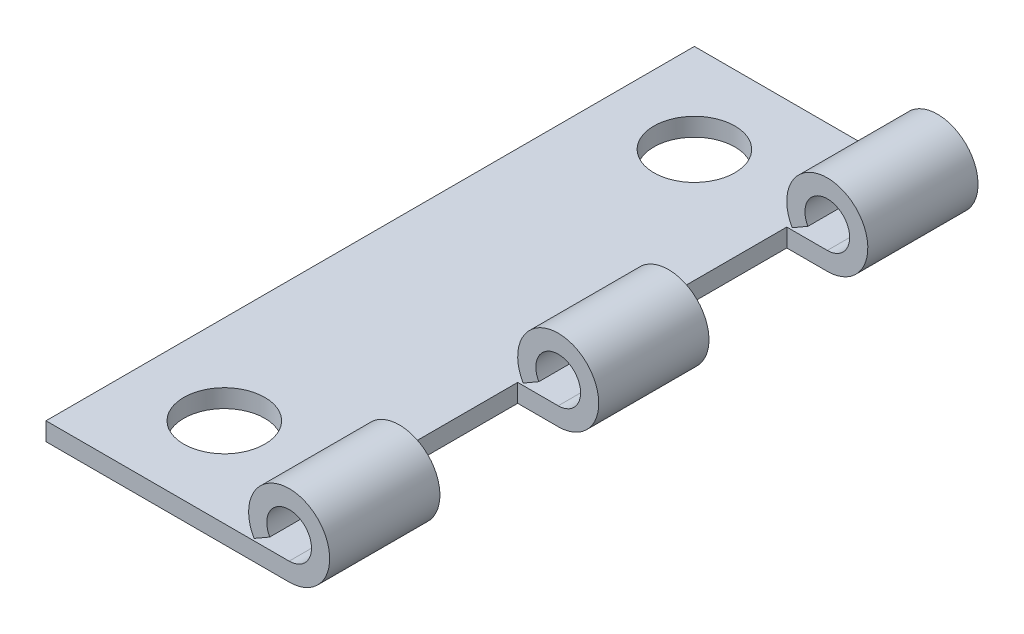
ISO-10303-21;
HEADER;
FILE_DESCRIPTION(('STEP AP214'),'2;1');
FILE_NAME('part.step','',(''),(''),'','','');
FILE_SCHEMA(('AUTOMOTIVE_DESIGN { 1 0 10303 214 1 1 1 1 }'));
ENDSEC;
DATA;
#1=APPLICATION_CONTEXT('core data for automotive mechanical design processes');
#2=APPLICATION_PROTOCOL_DEFINITION('international standard','automotive_design',2000,#1);
#3=PRODUCT_CONTEXT('',#1,'mechanical');
#4=PRODUCT('Part','Part','',(#3));
#5=PRODUCT_RELATED_PRODUCT_CATEGORY('part','',(#4));
#6=PRODUCT_DEFINITION_FORMATION('','',#4);
#7=PRODUCT_DEFINITION_CONTEXT('part definition',#1,'design');
#8=PRODUCT_DEFINITION('design','',#6,#7);
#9=PRODUCT_DEFINITION_SHAPE('','',#8);
#10=(LENGTH_UNIT() NAMED_UNIT(*) SI_UNIT(.MILLI.,.METRE.));
#11=(NAMED_UNIT(*) PLANE_ANGLE_UNIT() SI_UNIT($,.RADIAN.));
#12=(NAMED_UNIT(*) SI_UNIT($,.STERADIAN.) SOLID_ANGLE_UNIT());
#13=UNCERTAINTY_MEASURE_WITH_UNIT(LENGTH_MEASURE(1.E-05),#10,'distance_accuracy_value','');
#14=(GEOMETRIC_REPRESENTATION_CONTEXT(3) GLOBAL_UNCERTAINTY_ASSIGNED_CONTEXT((#13)) GLOBAL_UNIT_ASSIGNED_CONTEXT((#10,
#11,#12)) REPRESENTATION_CONTEXT('',''));
#15=CARTESIAN_POINT('',(0.,0.,0.));
#16=DIRECTION('',(0.,0.,1.));
#17=DIRECTION('',(1.,0.,0.));
#18=AXIS2_PLACEMENT_3D('',#15,#16,#17);
#19=CARTESIAN_POINT('',(0.,0.,50.8));
#20=DIRECTION('',(0.,1.,0.));
#21=DIRECTION('',(0.,0.,1.));
#22=AXIS2_PLACEMENT_3D('',#19,#20,#21);
#23=PLANE('',#22);
#24=CARTESIAN_POINT('',(6.985,0.,6.985));
#25=DIRECTION('',(0.,-1.,0.));
#26=DIRECTION('',(0.,0.,-1.));
#27=AXIS2_PLACEMENT_3D('',#24,#25,#26);
#28=CIRCLE('',#27,3.175);
#29=CARTESIAN_POINT('',(6.985,0.,3.81));
#30=VERTEX_POINT('',#29);
#31=EDGE_CURVE('E300',#30,#30,#28,.T.);
#32=ORIENTED_EDGE('',*,*,#31,.F.);
#33=EDGE_LOOP('',(#32));
#34=FACE_BOUND('',#33,.T.);
#35=CARTESIAN_POINT('',(6.985,0.,43.815));
#36=DIRECTION('',(0.,-1.,0.));
#37=DIRECTION('',(0.,0.,-1.));
#38=AXIS2_PLACEMENT_3D('',#35,#36,#37);
#39=CIRCLE('',#38,3.175);
#40=CARTESIAN_POINT('',(6.985,0.,40.64));
#41=VERTEX_POINT('',#40);
#42=EDGE_CURVE('E293',#41,#41,#39,.T.);
#43=ORIENTED_EDGE('',*,*,#42,.F.);
#44=EDGE_LOOP('',(#43));
#45=FACE_BOUND('',#44,.T.);
#46=DIRECTION('',(-1.,0.,0.));
#47=VECTOR('',#46,1.);
#48=CARTESIAN_POINT('',(0.,0.,29.718));
#49=LINE('',#48,#47);
#50=CARTESIAN_POINT('',(19.05,0.,29.718));
#51=VERTEX_POINT('',#50);
#52=CARTESIAN_POINT('',(15.875,0.,29.718));
#53=VERTEX_POINT('',#52);
#54=EDGE_CURVE('E173',#51,#53,#49,.T.);
#55=ORIENTED_EDGE('',*,*,#54,.T.);
#56=DIRECTION('',(0.,0.,-1.));
#57=VECTOR('',#56,1.);
#58=CARTESIAN_POINT('',(15.875,0.,0.));
#59=LINE('',#58,#57);
#60=CARTESIAN_POINT('',(15.875,0.,42.164));
#61=VERTEX_POINT('',#60);
#62=EDGE_CURVE('E170',#61,#53,#59,.T.);
#63=ORIENTED_EDGE('',*,*,#62,.F.);
#64=DIRECTION('',(1.,0.,0.));
#65=VECTOR('',#64,1.);
#66=CARTESIAN_POINT('',(0.,0.,42.164));
#67=LINE('',#66,#65);
#68=CARTESIAN_POINT('',(19.05,0.,42.164));
#69=VERTEX_POINT('',#68);
#70=EDGE_CURVE('E176',#61,#69,#67,.T.);
#71=ORIENTED_EDGE('',*,*,#70,.T.);
#72=DIRECTION('',(0.,0.,-1.));
#73=VECTOR('',#72,1.);
#74=CARTESIAN_POINT('',(19.05,0.,50.8));
#75=LINE('',#74,#73);
#76=CARTESIAN_POINT('',(19.05,0.,50.8));
#77=VERTEX_POINT('',#76);
#78=EDGE_CURVE('E276',#77,#69,#75,.T.);
#79=ORIENTED_EDGE('',*,*,#78,.F.);
#80=DIRECTION('',(1.,0.,0.));
#81=VECTOR('',#80,1.);
#82=CARTESIAN_POINT('',(0.,0.,50.8));
#83=LINE('',#82,#81);
#84=CARTESIAN_POINT('',(0.,0.,50.8));
#85=VERTEX_POINT('',#84);
#86=EDGE_CURVE('E231',#85,#77,#83,.T.);
#87=ORIENTED_EDGE('',*,*,#86,.F.);
#88=DIRECTION('',(0.,0.,-1.));
#89=VECTOR('',#88,1.);
#90=CARTESIAN_POINT('',(0.,0.,50.8));
#91=LINE('',#90,#89);
#92=CARTESIAN_POINT('',(0.,0.,0.));
#93=VERTEX_POINT('',#92);
#94=EDGE_CURVE('E278',#85,#93,#91,.T.);
#95=ORIENTED_EDGE('',*,*,#94,.T.);
#96=DIRECTION('',(1.,0.,0.));
#97=VECTOR('',#96,1.);
#98=CARTESIAN_POINT('',(0.,0.,0.));
#99=LINE('',#98,#97);
#100=CARTESIAN_POINT('',(19.05,0.,0.));
#101=VERTEX_POINT('',#100);
#102=EDGE_CURVE('E245',#93,#101,#99,.T.);
#103=ORIENTED_EDGE('',*,*,#102,.T.);
#104=CARTESIAN_POINT('',(19.05,0.,8.636));
#105=VERTEX_POINT('',#104);
#106=EDGE_CURVE('E274',#105,#101,#75,.T.);
#107=ORIENTED_EDGE('',*,*,#106,.F.);
#108=DIRECTION('',(-1.,0.,0.));
#109=VECTOR('',#108,1.);
#110=CARTESIAN_POINT('',(0.,0.,8.63599999999999));
#111=LINE('',#110,#109);
#112=CARTESIAN_POINT('',(15.875,0.,8.636));
#113=VERTEX_POINT('',#112);
#114=EDGE_CURVE('E206',#105,#113,#111,.T.);
#115=ORIENTED_EDGE('',*,*,#114,.T.);
#116=DIRECTION('',(0.,0.,-1.));
#117=VECTOR('',#116,1.);
#118=CARTESIAN_POINT('',(15.875,0.,0.));
#119=LINE('',#118,#117);
#120=CARTESIAN_POINT('',(15.875,0.,21.082));
#121=VERTEX_POINT('',#120);
#122=EDGE_CURVE('E203',#121,#113,#119,.T.);
#123=ORIENTED_EDGE('',*,*,#122,.F.);
#124=DIRECTION('',(-1.,0.,0.));
#125=VECTOR('',#124,1.);
#126=CARTESIAN_POINT('',(0.,0.,21.082));
#127=LINE('',#126,#125);
#128=CARTESIAN_POINT('',(19.05,0.,21.082));
#129=VERTEX_POINT('',#128);
#130=EDGE_CURVE('E201',#129,#121,#127,.T.);
#131=ORIENTED_EDGE('',*,*,#130,.F.);
#132=EDGE_CURVE('E279',#51,#129,#75,.T.);
#133=ORIENTED_EDGE('',*,*,#132,.F.);
#134=EDGE_LOOP('',(#55,#63,#71,#79,#87,#95,#103,#107,#115,#123,#131,#133));
#135=FACE_BOUND('',#134,.T.);
#136=ADVANCED_FACE('F37',(#34,#45,#135),#23,.F.);
#137=CARTESIAN_POINT('',(19.05,3.175,50.8));
#138=DIRECTION('',(0.,0.,-1.));
#139=DIRECTION('',(-1.,0.,0.));
#140=AXIS2_PLACEMENT_3D('',#137,#138,#139);
#141=CYLINDRICAL_SURFACE('',#140,3.175);
#142=DIRECTION('',(0.,0.,-1.));
#143=VECTOR('',#142,1.);
#144=CARTESIAN_POINT('',(16.3003693429844,1.5875,50.8));
#145=LINE('',#144,#143);
#146=CARTESIAN_POINT('',(16.3003693429844,1.5875,29.718));
#147=VERTEX_POINT('',#146);
#148=CARTESIAN_POINT('',(16.3003693429844,1.5875,21.082));
#149=VERTEX_POINT('',#148);
#150=EDGE_CURVE('E275',#147,#149,#145,.T.);
#151=ORIENTED_EDGE('',*,*,#150,.F.);
#152=CARTESIAN_POINT('',(19.05,3.175,29.718));
#153=DIRECTION('',(0.,0.,1.));
#154=DIRECTION('',(1.,0.,0.));
#155=AXIS2_PLACEMENT_3D('',#152,#153,#154);
#156=CIRCLE('',#155,3.175);
#157=EDGE_CURVE('E199',#51,#147,#156,.T.);
#158=ORIENTED_EDGE('',*,*,#157,.F.);
#159=ORIENTED_EDGE('',*,*,#132,.T.);
#160=CARTESIAN_POINT('',(19.05,3.175,21.082));
#161=DIRECTION('',(0.,0.,1.));
#162=DIRECTION('',(1.,0.,0.));
#163=AXIS2_PLACEMENT_3D('',#160,#161,#162);
#164=CIRCLE('',#163,3.175);
#165=EDGE_CURVE('E218',#129,#149,#164,.T.);
#166=ORIENTED_EDGE('',*,*,#165,.T.);
#167=EDGE_LOOP('',(#151,#158,#159,#166));
#168=FACE_BOUND('',#167,.T.);
#169=ADVANCED_FACE('F310',(#168),#141,.T.);
#170=CARTESIAN_POINT('',(19.05,3.175,42.164));
#171=DIRECTION('',(0.,0.,-1.));
#172=DIRECTION('',(-1.,0.,0.));
#173=AXIS2_PLACEMENT_3D('',#170,#171,#172);
#174=CIRCLE('',#173,3.175);
#175=CARTESIAN_POINT('',(16.3003693429844,1.5875,42.164));
#176=VERTEX_POINT('',#175);
#177=EDGE_CURVE('E179',#176,#69,#174,.T.);
#178=ORIENTED_EDGE('',*,*,#177,.F.);
#179=CARTESIAN_POINT('',(16.3003693429844,1.5875,50.8));
#180=VERTEX_POINT('',#179);
#181=EDGE_CURVE('E271',#180,#176,#145,.T.);
#182=ORIENTED_EDGE('',*,*,#181,.F.);
#183=CARTESIAN_POINT('',(19.05,3.175,50.8));
#184=DIRECTION('',(0.,0.,1.));
#185=DIRECTION('',(1.,0.,0.));
#186=AXIS2_PLACEMENT_3D('',#183,#184,#185);
#187=CIRCLE('',#186,3.175);
#188=EDGE_CURVE('E234',#77,#180,#187,.T.);
#189=ORIENTED_EDGE('',*,*,#188,.F.);
#190=ORIENTED_EDGE('',*,*,#78,.T.);
#191=EDGE_LOOP('',(#178,#182,#189,#190));
#192=FACE_BOUND('',#191,.T.);
#193=ADVANCED_FACE('F314',(#192),#141,.T.);
#194=CARTESIAN_POINT('',(19.0500000000001,1.4224,50.8));
#195=DIRECTION('',(0.,-1.,0.));
#196=DIRECTION('',(1.,0.,0.));
#197=AXIS2_PLACEMENT_3D('',#194,#195,#196);
#198=PLANE('',#197);
#199=CARTESIAN_POINT('',(6.985,1.42239999999999,6.985));
#200=DIRECTION('',(0.,-1.,0.));
#201=DIRECTION('',(1.,0.,0.));
#202=AXIS2_PLACEMENT_3D('',#199,#200,#201);
#203=CIRCLE('',#202,3.175);
#204=CARTESIAN_POINT('',(10.16,1.4224,6.985));
#205=VERTEX_POINT('',#204);
#206=EDGE_CURVE('E41',#205,#205,#203,.T.);
#207=ORIENTED_EDGE('',*,*,#206,.T.);
#208=EDGE_LOOP('',(#207));
#209=FACE_BOUND('',#208,.T.);
#210=CARTESIAN_POINT('',(6.985,1.42239999999999,43.815));
#211=DIRECTION('',(0.,-1.,0.));
#212=DIRECTION('',(1.,0.,0.));
#213=AXIS2_PLACEMENT_3D('',#210,#211,#212);
#214=CIRCLE('',#213,3.175);
#215=CARTESIAN_POINT('',(10.16,1.4224,43.815));
#216=VERTEX_POINT('',#215);
#217=EDGE_CURVE('E183',#216,#216,#214,.T.);
#218=ORIENTED_EDGE('',*,*,#217,.T.);
#219=EDGE_LOOP('',(#218));
#220=FACE_BOUND('',#219,.T.);
#221=DIRECTION('',(-1.,0.,0.));
#222=VECTOR('',#221,1.);
#223=CARTESIAN_POINT('',(19.0500000000001,1.4224,29.718));
#224=LINE('',#223,#222);
#225=CARTESIAN_POINT('',(19.0500000000001,1.4224,29.718));
#226=VERTEX_POINT('',#225);
#227=CARTESIAN_POINT('',(15.875,1.42239999999999,29.718));
#228=VERTEX_POINT('',#227);
#229=EDGE_CURVE('E197',#226,#228,#224,.T.);
#230=ORIENTED_EDGE('',*,*,#229,.F.);
#231=DIRECTION('',(0.,0.,-1.));
#232=VECTOR('',#231,1.);
#233=CARTESIAN_POINT('',(19.0500000000001,1.4224,50.8));
#234=LINE('',#233,#232);
#235=CARTESIAN_POINT('',(19.0500000000001,1.4224,21.082));
#236=VERTEX_POINT('',#235);
#237=EDGE_CURVE('E265',#226,#236,#234,.T.);
#238=ORIENTED_EDGE('',*,*,#237,.T.);
#239=DIRECTION('',(-1.,0.,0.));
#240=VECTOR('',#239,1.);
#241=CARTESIAN_POINT('',(19.0500000000001,1.4224,21.082));
#242=LINE('',#241,#240);
#243=CARTESIAN_POINT('',(15.875,1.4224,21.082));
#244=VERTEX_POINT('',#243);
#245=EDGE_CURVE('E282',#236,#244,#242,.T.);
#246=ORIENTED_EDGE('',*,*,#245,.T.);
#247=DIRECTION('',(0.,0.,-1.));
#248=VECTOR('',#247,1.);
#249=CARTESIAN_POINT('',(15.875,1.4224,50.8));
#250=LINE('',#249,#248);
#251=CARTESIAN_POINT('',(15.875,1.42239999999999,8.636));
#252=VERTEX_POINT('',#251);
#253=EDGE_CURVE('E285',#244,#252,#250,.T.);
#254=ORIENTED_EDGE('',*,*,#253,.T.);
#255=DIRECTION('',(-1.,0.,0.));
#256=VECTOR('',#255,1.);
#257=CARTESIAN_POINT('',(19.0500000000001,1.4224,8.636));
#258=LINE('',#257,#256);
#259=CARTESIAN_POINT('',(19.0500000000001,1.4224,8.636));
#260=VERTEX_POINT('',#259);
#261=EDGE_CURVE('E288',#260,#252,#258,.T.);
#262=ORIENTED_EDGE('',*,*,#261,.F.);
#263=CARTESIAN_POINT('',(19.0500000000001,1.4224,0.));
#264=VERTEX_POINT('',#263);
#265=EDGE_CURVE('E260',#260,#264,#234,.T.);
#266=ORIENTED_EDGE('',*,*,#265,.T.);
#267=DIRECTION('',(-1.,0.,0.));
#268=VECTOR('',#267,1.);
#269=CARTESIAN_POINT('',(19.0500000000001,1.4224,0.));
#270=LINE('',#269,#268);
#271=CARTESIAN_POINT('',(0.,1.42239999999999,0.));
#272=VERTEX_POINT('',#271);
#273=EDGE_CURVE('E232',#264,#272,#270,.T.);
#274=ORIENTED_EDGE('',*,*,#273,.T.);
#275=DIRECTION('',(0.,0.,-1.));
#276=VECTOR('',#275,1.);
#277=CARTESIAN_POINT('',(0.,1.42239999999999,50.8));
#278=LINE('',#277,#276);
#279=CARTESIAN_POINT('',(0.,1.42239999999999,50.8));
#280=VERTEX_POINT('',#279);
#281=EDGE_CURVE('E242',#280,#272,#278,.T.);
#282=ORIENTED_EDGE('',*,*,#281,.F.);
#283=DIRECTION('',(-1.,0.,0.));
#284=VECTOR('',#283,1.);
#285=CARTESIAN_POINT('',(19.0500000000001,1.4224,50.8));
#286=LINE('',#285,#284);
#287=CARTESIAN_POINT('',(19.0500000000001,1.4224,50.8));
#288=VERTEX_POINT('',#287);
#289=EDGE_CURVE('E240',#288,#280,#286,.T.);
#290=ORIENTED_EDGE('',*,*,#289,.F.);
#291=CARTESIAN_POINT('',(19.0500000000001,1.4224,42.164));
#292=VERTEX_POINT('',#291);
#293=EDGE_CURVE('E261',#288,#292,#234,.T.);
#294=ORIENTED_EDGE('',*,*,#293,.T.);
#295=DIRECTION('',(1.,0.,0.));
#296=VECTOR('',#295,1.);
#297=CARTESIAN_POINT('',(19.0500000000001,1.4224,42.164));
#298=LINE('',#297,#296);
#299=CARTESIAN_POINT('',(15.875,1.4224,42.164));
#300=VERTEX_POINT('',#299);
#301=EDGE_CURVE('E54',#300,#292,#298,.T.);
#302=ORIENTED_EDGE('',*,*,#301,.F.);
#303=DIRECTION('',(0.,0.,-1.));
#304=VECTOR('',#303,1.);
#305=CARTESIAN_POINT('',(15.875,1.4224,50.8));
#306=LINE('',#305,#304);
#307=EDGE_CURVE('E11',#300,#228,#306,.T.);
#308=ORIENTED_EDGE('',*,*,#307,.T.);
#309=EDGE_LOOP('',(#230,#238,#246,#254,#262,#266,#274,#282,#290,#294,#302,#308));
#310=FACE_BOUND('',#309,.T.);
#311=ADVANCED_FACE('F327',(#209,#220,#310),#198,.F.);
#312=CARTESIAN_POINT('',(16.3003693429844,1.5875,50.8));
#313=DIRECTION('',(-0.499999999999978,0.866025403784451,0.));
#314=DIRECTION('',(-0.866025403784451,-0.499999999999978,0.));
#315=AXIS2_PLACEMENT_3D('',#312,#313,#314);
#316=PLANE('',#315);
#317=DIRECTION('',(0.866025403784451,0.499999999999978,0.));
#318=VECTOR('',#317,1.);
#319=CARTESIAN_POINT('',(16.3003693429844,1.5875,29.718));
#320=LINE('',#319,#318);
#321=CARTESIAN_POINT('',(17.5322038773275,2.2987,29.718));
#322=VERTEX_POINT('',#321);
#323=EDGE_CURVE('E195',#147,#322,#320,.T.);
#324=ORIENTED_EDGE('',*,*,#323,.F.);
#325=ORIENTED_EDGE('',*,*,#150,.T.);
#326=DIRECTION('',(0.866025403784451,0.499999999999978,0.));
#327=VECTOR('',#326,1.);
#328=CARTESIAN_POINT('',(16.3003693429844,1.58750000000001,21.082));
#329=LINE('',#328,#327);
#330=CARTESIAN_POINT('',(17.5322038773275,2.2987,21.082));
#331=VERTEX_POINT('',#330);
#332=EDGE_CURVE('E215',#149,#331,#329,.T.);
#333=ORIENTED_EDGE('',*,*,#332,.T.);
#334=DIRECTION('',(0.,0.,-1.));
#335=VECTOR('',#334,1.);
#336=CARTESIAN_POINT('',(17.5322038773275,2.2987,50.8));
#337=LINE('',#336,#335);
#338=EDGE_CURVE('E270',#322,#331,#337,.T.);
#339=ORIENTED_EDGE('',*,*,#338,.F.);
#340=EDGE_LOOP('',(#324,#325,#333,#339));
#341=FACE_BOUND('',#340,.T.);
#342=ADVANCED_FACE('F323',(#341),#316,.F.);
#343=DIRECTION('',(-0.866025403784451,-0.499999999999978,0.));
#344=VECTOR('',#343,1.);
#345=CARTESIAN_POINT('',(16.3003693429844,1.5875,42.164));
#346=LINE('',#345,#344);
#347=CARTESIAN_POINT('',(17.5322038773275,2.2987,42.164));
#348=VERTEX_POINT('',#347);
#349=EDGE_CURVE('E190',#348,#176,#346,.T.);
#350=ORIENTED_EDGE('',*,*,#349,.F.);
#351=CARTESIAN_POINT('',(17.5322038773275,2.2987,50.8));
#352=VERTEX_POINT('',#351);
#353=EDGE_CURVE('E266',#352,#348,#337,.T.);
#354=ORIENTED_EDGE('',*,*,#353,.F.);
#355=DIRECTION('',(0.866025403784451,0.499999999999978,0.));
#356=VECTOR('',#355,1.);
#357=CARTESIAN_POINT('',(16.3003693429844,1.5875,50.8));
#358=LINE('',#357,#356);
#359=EDGE_CURVE('E236',#180,#352,#358,.T.);
#360=ORIENTED_EDGE('',*,*,#359,.F.);
#361=ORIENTED_EDGE('',*,*,#181,.T.);
#362=EDGE_LOOP('',(#350,#354,#360,#361));
#363=FACE_BOUND('',#362,.T.);
#364=ADVANCED_FACE('F326',(#363),#316,.F.);
#365=CARTESIAN_POINT('',(19.0500000000001,3.175,50.8));
#366=DIRECTION('',(0.,0.,-1.));
#367=DIRECTION('',(-1.,0.,0.));
#368=AXIS2_PLACEMENT_3D('',#365,#366,#367);
#369=CYLINDRICAL_SURFACE('',#368,1.7526);
#370=CARTESIAN_POINT('',(19.0500000000001,3.175,29.718));
#371=DIRECTION('',(0.,0.,1.));
#372=DIRECTION('',(1.,0.,0.));
#373=AXIS2_PLACEMENT_3D('',#370,#371,#372);
#374=CIRCLE('',#373,1.7526);
#375=EDGE_CURVE('E46',#322,#226,#374,.F.);
#376=ORIENTED_EDGE('',*,*,#375,.F.);
#377=ORIENTED_EDGE('',*,*,#338,.T.);
#378=CARTESIAN_POINT('',(19.0500000000001,3.175,21.082));
#379=DIRECTION('',(0.,0.,1.));
#380=DIRECTION('',(1.,0.,0.));
#381=AXIS2_PLACEMENT_3D('',#378,#379,#380);
#382=CIRCLE('',#381,1.7526);
#383=EDGE_CURVE('E211',#331,#236,#382,.F.);
#384=ORIENTED_EDGE('',*,*,#383,.T.);
#385=ORIENTED_EDGE('',*,*,#237,.F.);
#386=EDGE_LOOP('',(#376,#377,#384,#385));
#387=FACE_BOUND('',#386,.T.);
#388=ADVANCED_FACE('F329',(#387),#369,.F.);
#389=CARTESIAN_POINT('',(19.0500000000001,3.175,42.164));
#390=DIRECTION('',(0.,0.,-1.));
#391=DIRECTION('',(-1.,0.,0.));
#392=AXIS2_PLACEMENT_3D('',#389,#390,#391);
#393=CIRCLE('',#392,1.7526);
#394=EDGE_CURVE('E290',#292,#348,#393,.F.);
#395=ORIENTED_EDGE('',*,*,#394,.F.);
#396=ORIENTED_EDGE('',*,*,#293,.F.);
#397=CARTESIAN_POINT('',(19.0500000000001,3.175,50.8));
#398=DIRECTION('',(0.,0.,-1.));
#399=DIRECTION('',(-1.,0.,0.));
#400=AXIS2_PLACEMENT_3D('',#397,#398,#399);
#401=CIRCLE('',#400,1.7526);
#402=EDGE_CURVE('E238',#352,#288,#401,.T.);
#403=ORIENTED_EDGE('',*,*,#402,.F.);
#404=ORIENTED_EDGE('',*,*,#353,.T.);
#405=EDGE_LOOP('',(#395,#396,#403,#404));
#406=FACE_BOUND('',#405,.T.);
#407=ADVANCED_FACE('F321',(#406),#369,.F.);
#408=CARTESIAN_POINT('',(16.3003693429844,1.58750000000001,8.636));
#409=VERTEX_POINT('',#408);
#410=CARTESIAN_POINT('',(16.3003693429844,1.5875,0.));
#411=VERTEX_POINT('',#410);
#412=EDGE_CURVE('E269',#409,#411,#145,.T.);
#413=ORIENTED_EDGE('',*,*,#412,.F.);
#414=CARTESIAN_POINT('',(19.05,3.175,8.636));
#415=DIRECTION('',(0.,0.,1.));
#416=DIRECTION('',(1.,0.,0.));
#417=AXIS2_PLACEMENT_3D('',#414,#415,#416);
#418=CIRCLE('',#417,3.175);
#419=EDGE_CURVE('E225',#105,#409,#418,.T.);
#420=ORIENTED_EDGE('',*,*,#419,.F.);
#421=ORIENTED_EDGE('',*,*,#106,.T.);
#422=CARTESIAN_POINT('',(19.05,3.175,0.));
#423=DIRECTION('',(0.,0.,1.));
#424=DIRECTION('',(1.,0.,0.));
#425=AXIS2_PLACEMENT_3D('',#422,#423,#424);
#426=CIRCLE('',#425,3.175);
#427=EDGE_CURVE('E248',#101,#411,#426,.T.);
#428=ORIENTED_EDGE('',*,*,#427,.T.);
#429=EDGE_LOOP('',(#413,#420,#421,#428));
#430=FACE_BOUND('',#429,.T.);
#431=ADVANCED_FACE('F317',(#430),#141,.T.);
#432=DIRECTION('',(0.866025403784451,0.499999999999978,0.));
#433=VECTOR('',#432,1.);
#434=CARTESIAN_POINT('',(16.3003693429844,1.58750000000001,8.636));
#435=LINE('',#434,#433);
#436=CARTESIAN_POINT('',(17.5322038773275,2.2987,8.636));
#437=VERTEX_POINT('',#436);
#438=EDGE_CURVE('E223',#409,#437,#435,.T.);
#439=ORIENTED_EDGE('',*,*,#438,.F.);
#440=ORIENTED_EDGE('',*,*,#412,.T.);
#441=DIRECTION('',(0.866025403784451,0.499999999999978,0.));
#442=VECTOR('',#441,1.);
#443=CARTESIAN_POINT('',(16.3003693429844,1.5875,0.));
#444=LINE('',#443,#442);
#445=CARTESIAN_POINT('',(17.5322038773275,2.2987,0.));
#446=VERTEX_POINT('',#445);
#447=EDGE_CURVE('E251',#411,#446,#444,.T.);
#448=ORIENTED_EDGE('',*,*,#447,.T.);
#449=EDGE_CURVE('E264',#437,#446,#337,.T.);
#450=ORIENTED_EDGE('',*,*,#449,.F.);
#451=EDGE_LOOP('',(#439,#440,#448,#450));
#452=FACE_BOUND('',#451,.T.);
#453=ADVANCED_FACE('F320',(#452),#316,.F.);
#454=CARTESIAN_POINT('',(19.0500000000001,3.175,8.636));
#455=DIRECTION('',(0.,0.,1.));
#456=DIRECTION('',(1.,0.,0.));
#457=AXIS2_PLACEMENT_3D('',#454,#455,#456);
#458=CIRCLE('',#457,1.7526);
#459=EDGE_CURVE('E221',#437,#260,#458,.F.);
#460=ORIENTED_EDGE('',*,*,#459,.F.);
#461=ORIENTED_EDGE('',*,*,#449,.T.);
#462=CARTESIAN_POINT('',(19.0500000000001,3.175,0.));
#463=DIRECTION('',(0.,0.,-1.));
#464=DIRECTION('',(-1.,0.,0.));
#465=AXIS2_PLACEMENT_3D('',#462,#463,#464);
#466=CIRCLE('',#465,1.7526);
#467=EDGE_CURVE('E254',#446,#264,#466,.T.);
#468=ORIENTED_EDGE('',*,*,#467,.T.);
#469=ORIENTED_EDGE('',*,*,#265,.F.);
#470=EDGE_LOOP('',(#460,#461,#468,#469));
#471=FACE_BOUND('',#470,.T.);
#472=ADVANCED_FACE('F333',(#471),#369,.F.);
#473=CARTESIAN_POINT('',(0.,1.42239999999999,50.8));
#474=DIRECTION('',(1.,0.,0.));
#475=DIRECTION('',(0.,1.,0.));
#476=AXIS2_PLACEMENT_3D('',#473,#474,#475);
#477=PLANE('',#476);
#478=DIRECTION('',(0.,-1.,0.));
#479=VECTOR('',#478,1.);
#480=CARTESIAN_POINT('',(0.,1.42239999999999,0.));
#481=LINE('',#480,#479);
#482=EDGE_CURVE('E227',#272,#93,#481,.T.);
#483=ORIENTED_EDGE('',*,*,#482,.T.);
#484=ORIENTED_EDGE('',*,*,#94,.F.);
#485=DIRECTION('',(0.,-1.,0.));
#486=VECTOR('',#485,1.);
#487=CARTESIAN_POINT('',(0.,1.42239999999999,50.8));
#488=LINE('',#487,#486);
#489=EDGE_CURVE('E228',#280,#85,#488,.T.);
#490=ORIENTED_EDGE('',*,*,#489,.F.);
#491=ORIENTED_EDGE('',*,*,#281,.T.);
#492=EDGE_LOOP('',(#483,#484,#490,#491));
#493=FACE_BOUND('',#492,.T.);
#494=ADVANCED_FACE('F39',(#493),#477,.F.);
#495=CARTESIAN_POINT('',(19.05,3.175,50.8));
#496=DIRECTION('',(0.,0.,1.));
#497=DIRECTION('',(1.,0.,0.));
#498=AXIS2_PLACEMENT_3D('',#495,#496,#497);
#499=PLANE('',#498);
#500=ORIENTED_EDGE('',*,*,#489,.T.);
#501=ORIENTED_EDGE('',*,*,#86,.T.);
#502=ORIENTED_EDGE('',*,*,#188,.T.);
#503=ORIENTED_EDGE('',*,*,#359,.T.);
#504=ORIENTED_EDGE('',*,*,#402,.T.);
#505=ORIENTED_EDGE('',*,*,#289,.T.);
#506=EDGE_LOOP('',(#500,#501,#502,#503,#504,#505));
#507=FACE_BOUND('',#506,.T.);
#508=ADVANCED_FACE('F341',(#507),#499,.T.);
#509=CARTESIAN_POINT('',(19.05,3.175,0.));
#510=DIRECTION('',(0.,0.,1.));
#511=DIRECTION('',(1.,0.,0.));
#512=AXIS2_PLACEMENT_3D('',#509,#510,#511);
#513=PLANE('',#512);
#514=ORIENTED_EDGE('',*,*,#482,.F.);
#515=ORIENTED_EDGE('',*,*,#273,.F.);
#516=ORIENTED_EDGE('',*,*,#467,.F.);
#517=ORIENTED_EDGE('',*,*,#447,.F.);
#518=ORIENTED_EDGE('',*,*,#427,.F.);
#519=ORIENTED_EDGE('',*,*,#102,.F.);
#520=EDGE_LOOP('',(#514,#515,#516,#517,#518,#519));
#521=FACE_BOUND('',#520,.T.);
#522=ADVANCED_FACE('F337',(#521),#513,.F.);
#523=CARTESIAN_POINT('',(0.,6.35,8.63599999999999));
#524=DIRECTION('',(0.,0.,1.));
#525=DIRECTION('',(1.,0.,0.));
#526=AXIS2_PLACEMENT_3D('',#523,#524,#525);
#527=PLANE('',#526);
#528=ORIENTED_EDGE('',*,*,#419,.T.);
#529=ORIENTED_EDGE('',*,*,#438,.T.);
#530=ORIENTED_EDGE('',*,*,#459,.T.);
#531=ORIENTED_EDGE('',*,*,#261,.T.);
#532=DIRECTION('',(0.,-1.,0.));
#533=VECTOR('',#532,1.);
#534=CARTESIAN_POINT('',(15.875,6.35,8.636));
#535=LINE('',#534,#533);
#536=EDGE_CURVE('E209',#252,#113,#535,.T.);
#537=ORIENTED_EDGE('',*,*,#536,.T.);
#538=ORIENTED_EDGE('',*,*,#114,.F.);
#539=EDGE_LOOP('',(#528,#529,#530,#531,#537,#538));
#540=FACE_BOUND('',#539,.T.);
#541=ADVANCED_FACE('F340',(#540),#527,.T.);
#542=CARTESIAN_POINT('',(15.875,6.35,0.));
#543=DIRECTION('',(-1.,0.,0.));
#544=DIRECTION('',(0.,0.,1.));
#545=AXIS2_PLACEMENT_3D('',#542,#543,#544);
#546=PLANE('',#545);
#547=DIRECTION('',(0.,-1.,0.));
#548=VECTOR('',#547,1.);
#549=CARTESIAN_POINT('',(15.875,6.35,21.082));
#550=LINE('',#549,#548);
#551=EDGE_CURVE('E62',#244,#121,#550,.T.);
#552=ORIENTED_EDGE('',*,*,#551,.T.);
#553=ORIENTED_EDGE('',*,*,#122,.T.);
#554=ORIENTED_EDGE('',*,*,#536,.F.);
#555=ORIENTED_EDGE('',*,*,#253,.F.);
#556=EDGE_LOOP('',(#552,#553,#554,#555));
#557=FACE_BOUND('',#556,.T.);
#558=ADVANCED_FACE('F349',(#557),#546,.F.);
#559=CARTESIAN_POINT('',(0.,6.35,21.082));
#560=DIRECTION('',(0.,0.,1.));
#561=DIRECTION('',(1.,0.,0.));
#562=AXIS2_PLACEMENT_3D('',#559,#560,#561);
#563=PLANE('',#562);
#564=ORIENTED_EDGE('',*,*,#130,.T.);
#565=ORIENTED_EDGE('',*,*,#551,.F.);
#566=ORIENTED_EDGE('',*,*,#245,.F.);
#567=ORIENTED_EDGE('',*,*,#383,.F.);
#568=ORIENTED_EDGE('',*,*,#332,.F.);
#569=ORIENTED_EDGE('',*,*,#165,.F.);
#570=EDGE_LOOP('',(#564,#565,#566,#567,#568,#569));
#571=FACE_BOUND('',#570,.T.);
#572=ADVANCED_FACE('F346',(#571),#563,.F.);
#573=CARTESIAN_POINT('',(15.875,6.35,0.));
#574=DIRECTION('',(-1.,0.,0.));
#575=DIRECTION('',(0.,0.,1.));
#576=AXIS2_PLACEMENT_3D('',#573,#574,#575);
#577=PLANE('',#576);
#578=DIRECTION('',(0.,-1.,0.));
#579=VECTOR('',#578,1.);
#580=CARTESIAN_POINT('',(15.875,6.35,42.164));
#581=LINE('',#580,#579);
#582=EDGE_CURVE('E165',#300,#61,#581,.T.);
#583=ORIENTED_EDGE('',*,*,#582,.T.);
#584=ORIENTED_EDGE('',*,*,#62,.T.);
#585=DIRECTION('',(0.,-1.,0.));
#586=VECTOR('',#585,1.);
#587=CARTESIAN_POINT('',(15.875,6.35,29.718));
#588=LINE('',#587,#586);
#589=EDGE_CURVE('E172',#228,#53,#588,.T.);
#590=ORIENTED_EDGE('',*,*,#589,.F.);
#591=ORIENTED_EDGE('',*,*,#307,.F.);
#592=EDGE_LOOP('',(#583,#584,#590,#591));
#593=FACE_BOUND('',#592,.T.);
#594=ADVANCED_FACE('F167',(#593),#577,.F.);
#595=CARTESIAN_POINT('',(0.,6.35,29.718));
#596=DIRECTION('',(0.,0.,1.));
#597=DIRECTION('',(1.,0.,0.));
#598=AXIS2_PLACEMENT_3D('',#595,#596,#597);
#599=PLANE('',#598);
#600=ORIENTED_EDGE('',*,*,#157,.T.);
#601=ORIENTED_EDGE('',*,*,#323,.T.);
#602=ORIENTED_EDGE('',*,*,#375,.T.);
#603=ORIENTED_EDGE('',*,*,#229,.T.);
#604=ORIENTED_EDGE('',*,*,#589,.T.);
#605=ORIENTED_EDGE('',*,*,#54,.F.);
#606=EDGE_LOOP('',(#600,#601,#602,#603,#604,#605));
#607=FACE_BOUND('',#606,.T.);
#608=ADVANCED_FACE('F359',(#607),#599,.T.);
#609=CARTESIAN_POINT('',(0.,6.35,42.164));
#610=DIRECTION('',(0.,0.,-1.));
#611=DIRECTION('',(-1.,0.,0.));
#612=AXIS2_PLACEMENT_3D('',#609,#610,#611);
#613=PLANE('',#612);
#614=ORIENTED_EDGE('',*,*,#177,.T.);
#615=ORIENTED_EDGE('',*,*,#70,.F.);
#616=ORIENTED_EDGE('',*,*,#582,.F.);
#617=ORIENTED_EDGE('',*,*,#301,.T.);
#618=ORIENTED_EDGE('',*,*,#394,.T.);
#619=ORIENTED_EDGE('',*,*,#349,.T.);
#620=EDGE_LOOP('',(#614,#615,#616,#617,#618,#619));
#621=FACE_BOUND('',#620,.T.);
#622=ADVANCED_FACE('F177',(#621),#613,.T.);
#623=CARTESIAN_POINT('',(6.985,6.35,43.815));
#624=DIRECTION('',(0.,-1.,0.));
#625=DIRECTION('',(0.,0.,-1.));
#626=AXIS2_PLACEMENT_3D('',#623,#624,#625);
#627=CYLINDRICAL_SURFACE('',#626,3.175);
#628=ORIENTED_EDGE('',*,*,#42,.T.);
#629=EDGE_LOOP('',(#628));
#630=FACE_BOUND('',#629,.T.);
#631=ORIENTED_EDGE('',*,*,#217,.F.);
#632=EDGE_LOOP('',(#631));
#633=FACE_BOUND('',#632,.T.);
#634=ADVANCED_FACE('F358',(#630,#633),#627,.F.);
#635=CARTESIAN_POINT('',(6.985,6.35,6.985));
#636=DIRECTION('',(0.,-1.,0.));
#637=DIRECTION('',(0.,0.,-1.));
#638=AXIS2_PLACEMENT_3D('',#635,#636,#637);
#639=CYLINDRICAL_SURFACE('',#638,3.175);
#640=ORIENTED_EDGE('',*,*,#31,.T.);
#641=EDGE_LOOP('',(#640));
#642=FACE_BOUND('',#641,.T.);
#643=ORIENTED_EDGE('',*,*,#206,.F.);
#644=EDGE_LOOP('',(#643));
#645=FACE_BOUND('',#644,.T.);
#646=ADVANCED_FACE('F305',(#642,#645),#639,.F.);
#647=CLOSED_SHELL('',(#136,#169,#193,#311,#342,#364,#388,#407,#431,#453,#472,#494,#508,#522,
#541,#558,#572,#594,#608,#622,#634,#646));
#648=MANIFOLD_SOLID_BREP('B2',#647);
#649=ADVANCED_BREP_SHAPE_REPRESENTATION('',(#18,#648),#14);
#650=SHAPE_DEFINITION_REPRESENTATION(#9,#649);
ENDSEC;
END-ISO-10303-21;
